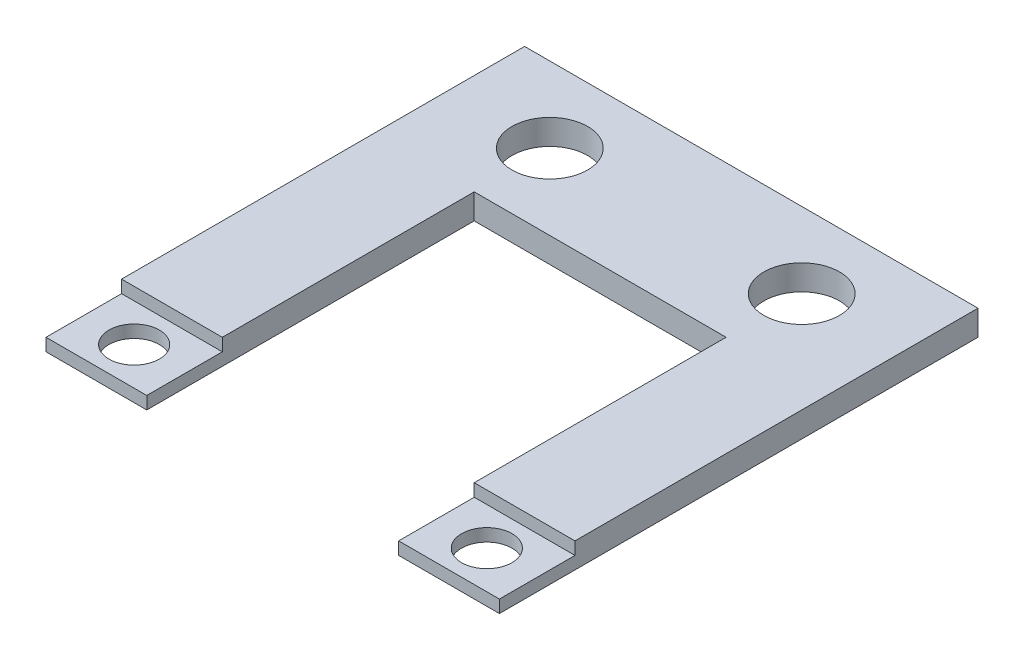
ISO-10303-21;
HEADER;
FILE_DESCRIPTION(('STEP AP214'),'2;1');
FILE_NAME('part.step','',(''),(''),'','','');
FILE_SCHEMA(('AUTOMOTIVE_DESIGN { 1 0 10303 214 1 1 1 1 }'));
ENDSEC;
DATA;
#1=APPLICATION_CONTEXT('core data for automotive mechanical design processes');
#2=APPLICATION_PROTOCOL_DEFINITION('international standard','automotive_design',2000,#1);
#3=PRODUCT_CONTEXT('',#1,'mechanical');
#4=PRODUCT('Part','Part','',(#3));
#5=PRODUCT_RELATED_PRODUCT_CATEGORY('part','',(#4));
#6=PRODUCT_DEFINITION_FORMATION('','',#4);
#7=PRODUCT_DEFINITION_CONTEXT('part definition',#1,'design');
#8=PRODUCT_DEFINITION('design','',#6,#7);
#9=PRODUCT_DEFINITION_SHAPE('','',#8);
#10=(LENGTH_UNIT() NAMED_UNIT(*) SI_UNIT(.MILLI.,.METRE.));
#11=(NAMED_UNIT(*) PLANE_ANGLE_UNIT() SI_UNIT($,.RADIAN.));
#12=(NAMED_UNIT(*) SI_UNIT($,.STERADIAN.) SOLID_ANGLE_UNIT());
#13=UNCERTAINTY_MEASURE_WITH_UNIT(LENGTH_MEASURE(1.E-05),#10,'distance_accuracy_value','');
#14=(GEOMETRIC_REPRESENTATION_CONTEXT(3) GLOBAL_UNCERTAINTY_ASSIGNED_CONTEXT((#13)) GLOBAL_UNIT_ASSIGNED_CONTEXT((#10,
#11,#12)) REPRESENTATION_CONTEXT('',''));
#15=CARTESIAN_POINT('',(0.,0.,0.));
#16=DIRECTION('',(0.,0.,1.));
#17=DIRECTION('',(1.,0.,0.));
#18=AXIS2_PLACEMENT_3D('',#15,#16,#17);
#19=CARTESIAN_POINT('',(7.9375,0.79375,0.));
#20=DIRECTION('',(-1.,0.,0.));
#21=DIRECTION('',(0.,0.,1.));
#22=AXIS2_PLACEMENT_3D('',#19,#20,#21);
#23=PLANE('',#22);
#24=DIRECTION('',(0.,1.,0.));
#25=VECTOR('',#24,1.);
#26=CARTESIAN_POINT('',(7.9375,0.,10.31875));
#27=LINE('',#26,#25);
#28=CARTESIAN_POINT('',(7.9375,0.,10.31875));
#29=VERTEX_POINT('',#28);
#30=CARTESIAN_POINT('',(7.9375,0.79375,10.31875));
#31=VERTEX_POINT('',#30);
#32=EDGE_CURVE('E178',#29,#31,#27,.T.);
#33=ORIENTED_EDGE('',*,*,#32,.T.);
#34=DIRECTION('',(0.,0.,-1.));
#35=VECTOR('',#34,1.);
#36=CARTESIAN_POINT('',(7.9375,0.79375,0.));
#37=LINE('',#36,#35);
#38=CARTESIAN_POINT('',(7.9375,0.79375,-5.55625));
#39=VERTEX_POINT('',#38);
#40=EDGE_CURVE('E196',#31,#39,#37,.T.);
#41=ORIENTED_EDGE('',*,*,#40,.T.);
#42=DIRECTION('',(0.,-1.,0.));
#43=VECTOR('',#42,1.);
#44=CARTESIAN_POINT('',(7.9375,0.79375,-5.55625));
#45=LINE('',#44,#43);
#46=CARTESIAN_POINT('',(7.9375,-0.79375,-5.55625));
#47=VERTEX_POINT('',#46);
#48=EDGE_CURVE('E213',#39,#47,#45,.T.);
#49=ORIENTED_EDGE('',*,*,#48,.T.);
#50=DIRECTION('',(0.,0.,-1.));
#51=VECTOR('',#50,1.);
#52=CARTESIAN_POINT('',(7.9375,-0.79375,0.));
#53=LINE('',#52,#51);
#54=CARTESIAN_POINT('',(7.9375,-0.79375,15.08125));
#55=VERTEX_POINT('',#54);
#56=EDGE_CURVE('E181',#55,#47,#53,.T.);
#57=ORIENTED_EDGE('',*,*,#56,.F.);
#58=DIRECTION('',(0.,-1.,0.));
#59=VECTOR('',#58,1.);
#60=CARTESIAN_POINT('',(7.9375,0.79375,15.08125));
#61=LINE('',#60,#59);
#62=CARTESIAN_POINT('',(7.9375,0.,15.08125));
#63=VERTEX_POINT('',#62);
#64=EDGE_CURVE('E11',#63,#55,#61,.T.);
#65=ORIENTED_EDGE('',*,*,#64,.F.);
#66=DIRECTION('',(0.,0.,1.));
#67=VECTOR('',#66,1.);
#68=CARTESIAN_POINT('',(7.9375,0.,15.08125));
#69=LINE('',#68,#67);
#70=EDGE_CURVE('E183',#29,#63,#69,.T.);
#71=ORIENTED_EDGE('',*,*,#70,.F.);
#72=EDGE_LOOP('',(#33,#41,#49,#57,#65,#71));
#73=FACE_BOUND('',#72,.T.);
#74=ADVANCED_FACE('F33',(#73),#23,.T.);
#75=CARTESIAN_POINT('',(0.,0.79375,15.08125));
#76=DIRECTION('',(0.,0.,-1.));
#77=DIRECTION('',(-1.,0.,0.));
#78=AXIS2_PLACEMENT_3D('',#75,#76,#77);
#79=PLANE('',#78);
#80=DIRECTION('',(0.,-1.,0.));
#81=VECTOR('',#80,1.);
#82=CARTESIAN_POINT('',(14.2875,0.79375,15.08125));
#83=LINE('',#82,#81);
#84=CARTESIAN_POINT('',(14.2875,0.,15.08125));
#85=VERTEX_POINT('',#84);
#86=CARTESIAN_POINT('',(14.2875,-0.79375,15.08125));
#87=VERTEX_POINT('',#86);
#88=EDGE_CURVE('E41',#85,#87,#83,.T.);
#89=ORIENTED_EDGE('',*,*,#88,.F.);
#90=DIRECTION('',(1.,0.,0.));
#91=VECTOR('',#90,1.);
#92=CARTESIAN_POINT('',(7.9375,0.,15.08125));
#93=LINE('',#92,#91);
#94=EDGE_CURVE('E185',#63,#85,#93,.T.);
#95=ORIENTED_EDGE('',*,*,#94,.F.);
#96=ORIENTED_EDGE('',*,*,#64,.T.);
#97=DIRECTION('',(1.,0.,0.));
#98=VECTOR('',#97,1.);
#99=CARTESIAN_POINT('',(0.,-0.79375,15.08125));
#100=LINE('',#99,#98);
#101=EDGE_CURVE('E216',#55,#87,#100,.T.);
#102=ORIENTED_EDGE('',*,*,#101,.T.);
#103=EDGE_LOOP('',(#89,#95,#96,#102));
#104=FACE_BOUND('',#103,.T.);
#105=ADVANCED_FACE('F266',(#104),#79,.F.);
#106=CARTESIAN_POINT('',(14.2875,0.79375,0.));
#107=DIRECTION('',(1.,0.,0.));
#108=DIRECTION('',(0.,0.,-1.));
#109=AXIS2_PLACEMENT_3D('',#106,#107,#108);
#110=PLANE('',#109);
#111=DIRECTION('',(0.,1.,0.));
#112=VECTOR('',#111,1.);
#113=CARTESIAN_POINT('',(14.2875,0.,10.31875));
#114=LINE('',#113,#112);
#115=CARTESIAN_POINT('',(14.2875,0.,10.31875));
#116=VERTEX_POINT('',#115);
#117=CARTESIAN_POINT('',(14.2875,0.79375,10.31875));
#118=VERTEX_POINT('',#117);
#119=EDGE_CURVE('E57',#116,#118,#114,.T.);
#120=ORIENTED_EDGE('',*,*,#119,.F.);
#121=DIRECTION('',(0.,0.,-1.));
#122=VECTOR('',#121,1.);
#123=CARTESIAN_POINT('',(14.2875,0.,15.08125));
#124=LINE('',#123,#122);
#125=EDGE_CURVE('E187',#85,#116,#124,.T.);
#126=ORIENTED_EDGE('',*,*,#125,.F.);
#127=ORIENTED_EDGE('',*,*,#88,.T.);
#128=DIRECTION('',(0.,0.,1.));
#129=VECTOR('',#128,1.);
#130=CARTESIAN_POINT('',(14.2875,-0.79375,0.));
#131=LINE('',#130,#129);
#132=CARTESIAN_POINT('',(14.2875,-0.79375,-15.08125));
#133=VERTEX_POINT('',#132);
#134=EDGE_CURVE('E219',#133,#87,#131,.T.);
#135=ORIENTED_EDGE('',*,*,#134,.F.);
#136=DIRECTION('',(0.,-1.,0.));
#137=VECTOR('',#136,1.);
#138=CARTESIAN_POINT('',(14.2875,0.79375,-15.08125));
#139=LINE('',#138,#137);
#140=CARTESIAN_POINT('',(14.2875,0.79375,-15.08125));
#141=VERTEX_POINT('',#140);
#142=EDGE_CURVE('E150',#141,#133,#139,.T.);
#143=ORIENTED_EDGE('',*,*,#142,.F.);
#144=DIRECTION('',(0.,0.,1.));
#145=VECTOR('',#144,1.);
#146=CARTESIAN_POINT('',(14.2875,0.79375,0.));
#147=LINE('',#146,#145);
#148=EDGE_CURVE('E198',#141,#118,#147,.T.);
#149=ORIENTED_EDGE('',*,*,#148,.T.);
#150=EDGE_LOOP('',(#120,#126,#127,#135,#143,#149));
#151=FACE_BOUND('',#150,.T.);
#152=ADVANCED_FACE('F261',(#151),#110,.T.);
#153=CARTESIAN_POINT('',(0.,0.79375,-15.08125));
#154=DIRECTION('',(0.,0.,-1.));
#155=DIRECTION('',(-1.,0.,0.));
#156=AXIS2_PLACEMENT_3D('',#153,#154,#155);
#157=PLANE('',#156);
#158=DIRECTION('',(1.,0.,0.));
#159=VECTOR('',#158,1.);
#160=CARTESIAN_POINT('',(0.,-0.79375,-15.08125));
#161=LINE('',#160,#159);
#162=CARTESIAN_POINT('',(-14.2875,-0.79375,-15.08125));
#163=VERTEX_POINT('',#162);
#164=EDGE_CURVE('E223',#163,#133,#161,.T.);
#165=ORIENTED_EDGE('',*,*,#164,.F.);
#166=DIRECTION('',(0.,-1.,0.));
#167=VECTOR('',#166,1.);
#168=CARTESIAN_POINT('',(-14.2875,0.79375,-15.08125));
#169=LINE('',#168,#167);
#170=CARTESIAN_POINT('',(-14.2875,0.79375,-15.08125));
#171=VERTEX_POINT('',#170);
#172=EDGE_CURVE('E148',#171,#163,#169,.T.);
#173=ORIENTED_EDGE('',*,*,#172,.F.);
#174=DIRECTION('',(1.,0.,0.));
#175=VECTOR('',#174,1.);
#176=CARTESIAN_POINT('',(0.,0.79375,-15.08125));
#177=LINE('',#176,#175);
#178=EDGE_CURVE('E202',#171,#141,#177,.T.);
#179=ORIENTED_EDGE('',*,*,#178,.T.);
#180=ORIENTED_EDGE('',*,*,#142,.T.);
#181=EDGE_LOOP('',(#165,#173,#179,#180));
#182=FACE_BOUND('',#181,.T.);
#183=ADVANCED_FACE('F258',(#182),#157,.T.);
#184=CARTESIAN_POINT('',(-14.2875,0.79375,0.));
#185=DIRECTION('',(1.,0.,0.));
#186=DIRECTION('',(0.,0.,-1.));
#187=AXIS2_PLACEMENT_3D('',#184,#185,#186);
#188=PLANE('',#187);
#189=DIRECTION('',(0.,0.,1.));
#190=VECTOR('',#189,1.);
#191=CARTESIAN_POINT('',(-14.2875,0.,15.08125));
#192=LINE('',#191,#190);
#193=CARTESIAN_POINT('',(-14.2875,0.,10.31875));
#194=VERTEX_POINT('',#193);
#195=CARTESIAN_POINT('',(-14.2875,0.,15.08125));
#196=VERTEX_POINT('',#195);
#197=EDGE_CURVE('E124',#194,#196,#192,.T.);
#198=ORIENTED_EDGE('',*,*,#197,.F.);
#199=DIRECTION('',(0.,1.,0.));
#200=VECTOR('',#199,1.);
#201=CARTESIAN_POINT('',(-14.2875,0.,10.31875));
#202=LINE('',#201,#200);
#203=CARTESIAN_POINT('',(-14.2875,0.79375,10.31875));
#204=VERTEX_POINT('',#203);
#205=EDGE_CURVE('E179',#194,#204,#202,.T.);
#206=ORIENTED_EDGE('',*,*,#205,.T.);
#207=DIRECTION('',(0.,0.,1.));
#208=VECTOR('',#207,1.);
#209=CARTESIAN_POINT('',(-14.2875,0.79375,0.));
#210=LINE('',#209,#208);
#211=EDGE_CURVE('E205',#171,#204,#210,.T.);
#212=ORIENTED_EDGE('',*,*,#211,.F.);
#213=ORIENTED_EDGE('',*,*,#172,.T.);
#214=DIRECTION('',(0.,0.,1.));
#215=VECTOR('',#214,1.);
#216=CARTESIAN_POINT('',(-14.2875,-0.79375,0.));
#217=LINE('',#216,#215);
#218=CARTESIAN_POINT('',(-14.2875,-0.79375,15.08125));
#219=VERTEX_POINT('',#218);
#220=EDGE_CURVE('E146',#163,#219,#217,.T.);
#221=ORIENTED_EDGE('',*,*,#220,.T.);
#222=DIRECTION('',(0.,-1.,0.));
#223=VECTOR('',#222,1.);
#224=CARTESIAN_POINT('',(-14.2875,0.79375,15.08125));
#225=LINE('',#224,#223);
#226=EDGE_CURVE('E139',#196,#219,#225,.T.);
#227=ORIENTED_EDGE('',*,*,#226,.F.);
#228=EDGE_LOOP('',(#198,#206,#212,#213,#221,#227));
#229=FACE_BOUND('',#228,.T.);
#230=ADVANCED_FACE('F144',(#229),#188,.F.);
#231=DIRECTION('',(0.,-1.,0.));
#232=VECTOR('',#231,1.);
#233=CARTESIAN_POINT('',(-7.9375,0.79375,15.08125));
#234=LINE('',#233,#232);
#235=CARTESIAN_POINT('',(-7.9375,0.,15.08125));
#236=VERTEX_POINT('',#235);
#237=CARTESIAN_POINT('',(-7.9375,-0.79375,15.08125));
#238=VERTEX_POINT('',#237);
#239=EDGE_CURVE('E141',#236,#238,#234,.T.);
#240=ORIENTED_EDGE('',*,*,#239,.F.);
#241=DIRECTION('',(1.,0.,0.));
#242=VECTOR('',#241,1.);
#243=CARTESIAN_POINT('',(-14.2875,0.,15.08125));
#244=LINE('',#243,#242);
#245=EDGE_CURVE('E127',#196,#236,#244,.T.);
#246=ORIENTED_EDGE('',*,*,#245,.F.);
#247=ORIENTED_EDGE('',*,*,#226,.T.);
#248=EDGE_CURVE('E220',#219,#238,#100,.T.);
#249=ORIENTED_EDGE('',*,*,#248,.T.);
#250=EDGE_LOOP('',(#240,#246,#247,#249));
#251=FACE_BOUND('',#250,.T.);
#252=ADVANCED_FACE('F137',(#251),#79,.F.);
#253=CARTESIAN_POINT('',(-7.9375,0.79375,0.));
#254=DIRECTION('',(-1.,0.,0.));
#255=DIRECTION('',(0.,0.,1.));
#256=AXIS2_PLACEMENT_3D('',#253,#254,#255);
#257=PLANE('',#256);
#258=DIRECTION('',(0.,0.,-1.));
#259=VECTOR('',#258,1.);
#260=CARTESIAN_POINT('',(-7.9375,0.79375,0.));
#261=LINE('',#260,#259);
#262=CARTESIAN_POINT('',(-7.9375,0.79375,10.31875));
#263=VERTEX_POINT('',#262);
#264=CARTESIAN_POINT('',(-7.9375,0.79375,-5.55625));
#265=VERTEX_POINT('',#264);
#266=EDGE_CURVE('E208',#263,#265,#261,.T.);
#267=ORIENTED_EDGE('',*,*,#266,.F.);
#268=DIRECTION('',(0.,1.,0.));
#269=VECTOR('',#268,1.);
#270=CARTESIAN_POINT('',(-7.9375,0.,10.31875));
#271=LINE('',#270,#269);
#272=CARTESIAN_POINT('',(-7.9375,0.,10.31875));
#273=VERTEX_POINT('',#272);
#274=EDGE_CURVE('E49',#273,#263,#271,.T.);
#275=ORIENTED_EDGE('',*,*,#274,.F.);
#276=DIRECTION('',(0.,0.,-1.));
#277=VECTOR('',#276,1.);
#278=CARTESIAN_POINT('',(-7.9375,0.,15.08125));
#279=LINE('',#278,#277);
#280=EDGE_CURVE('E142',#236,#273,#279,.T.);
#281=ORIENTED_EDGE('',*,*,#280,.F.);
#282=ORIENTED_EDGE('',*,*,#239,.T.);
#283=DIRECTION('',(0.,0.,-1.));
#284=VECTOR('',#283,1.);
#285=CARTESIAN_POINT('',(-7.9375,-0.79375,0.));
#286=LINE('',#285,#284);
#287=CARTESIAN_POINT('',(-7.9375,-0.79375,-5.55625));
#288=VERTEX_POINT('',#287);
#289=EDGE_CURVE('E227',#238,#288,#286,.T.);
#290=ORIENTED_EDGE('',*,*,#289,.T.);
#291=DIRECTION('',(0.,-1.,0.));
#292=VECTOR('',#291,1.);
#293=CARTESIAN_POINT('',(-7.9375,0.79375,-5.55625));
#294=LINE('',#293,#292);
#295=EDGE_CURVE('E152',#265,#288,#294,.T.);
#296=ORIENTED_EDGE('',*,*,#295,.F.);
#297=EDGE_LOOP('',(#267,#275,#281,#282,#290,#296));
#298=FACE_BOUND('',#297,.T.);
#299=ADVANCED_FACE('F251',(#298),#257,.F.);
#300=CARTESIAN_POINT('',(0.,0.79375,-5.55625));
#301=DIRECTION('',(0.,0.,-1.));
#302=DIRECTION('',(-1.,0.,0.));
#303=AXIS2_PLACEMENT_3D('',#300,#301,#302);
#304=PLANE('',#303);
#305=DIRECTION('',(1.,0.,0.));
#306=VECTOR('',#305,1.);
#307=CARTESIAN_POINT('',(0.,-0.79375,-5.55625));
#308=LINE('',#307,#306);
#309=EDGE_CURVE('E199',#288,#47,#308,.T.);
#310=ORIENTED_EDGE('',*,*,#309,.T.);
#311=ORIENTED_EDGE('',*,*,#48,.F.);
#312=DIRECTION('',(1.,0.,0.));
#313=VECTOR('',#312,1.);
#314=CARTESIAN_POINT('',(0.,0.79375,-5.55625));
#315=LINE('',#314,#313);
#316=EDGE_CURVE('E210',#265,#39,#315,.T.);
#317=ORIENTED_EDGE('',*,*,#316,.F.);
#318=ORIENTED_EDGE('',*,*,#295,.T.);
#319=EDGE_LOOP('',(#310,#311,#317,#318));
#320=FACE_BOUND('',#319,.T.);
#321=ADVANCED_FACE('F236',(#320),#304,.F.);
#322=CARTESIAN_POINT('',(0.,0.79375,0.));
#323=DIRECTION('',(0.,1.,0.));
#324=DIRECTION('',(0.,0.,1.));
#325=AXIS2_PLACEMENT_3D('',#322,#323,#324);
#326=PLANE('',#325);
#327=CARTESIAN_POINT('',(-7.9375,0.79375,-10.31875));
#328=DIRECTION('',(0.,1.,0.));
#329=DIRECTION('',(0.,0.,1.));
#330=AXIS2_PLACEMENT_3D('',#327,#328,#329);
#331=CIRCLE('',#330,2.38125);
#332=CARTESIAN_POINT('',(-7.9375,0.79375,-7.9375));
#333=VERTEX_POINT('',#332);
#334=EDGE_CURVE('E170',#333,#333,#331,.T.);
#335=ORIENTED_EDGE('',*,*,#334,.F.);
#336=EDGE_LOOP('',(#335));
#337=FACE_BOUND('',#336,.T.);
#338=CARTESIAN_POINT('',(7.93749999999993,0.79375,-10.31875));
#339=DIRECTION('',(0.,1.,0.));
#340=DIRECTION('',(0.,0.,1.));
#341=AXIS2_PLACEMENT_3D('',#338,#339,#340);
#342=CIRCLE('',#341,2.38125000000001);
#343=CARTESIAN_POINT('',(7.93749999999993,0.79375,-7.93749999999999));
#344=VERTEX_POINT('',#343);
#345=EDGE_CURVE('E418',#344,#344,#342,.T.);
#346=ORIENTED_EDGE('',*,*,#345,.F.);
#347=EDGE_LOOP('',(#346));
#348=FACE_BOUND('',#347,.T.);
#349=DIRECTION('',(-1.,0.,0.));
#350=VECTOR('',#349,1.);
#351=CARTESIAN_POINT('',(-14.2875,0.79375,10.31875));
#352=LINE('',#351,#350);
#353=EDGE_CURVE('E133',#263,#204,#352,.T.);
#354=ORIENTED_EDGE('',*,*,#353,.F.);
#355=ORIENTED_EDGE('',*,*,#266,.T.);
#356=ORIENTED_EDGE('',*,*,#316,.T.);
#357=ORIENTED_EDGE('',*,*,#40,.F.);
#358=DIRECTION('',(-1.,0.,0.));
#359=VECTOR('',#358,1.);
#360=CARTESIAN_POINT('',(7.9375,0.79375,10.31875));
#361=LINE('',#360,#359);
#362=EDGE_CURVE('E163',#118,#31,#361,.T.);
#363=ORIENTED_EDGE('',*,*,#362,.F.);
#364=ORIENTED_EDGE('',*,*,#148,.F.);
#365=ORIENTED_EDGE('',*,*,#178,.F.);
#366=ORIENTED_EDGE('',*,*,#211,.T.);
#367=EDGE_LOOP('',(#354,#355,#356,#357,#363,#364,#365,#366));
#368=FACE_BOUND('',#367,.T.);
#369=ADVANCED_FACE('F250',(#337,#348,#368),#326,.T.);
#370=CARTESIAN_POINT('',(0.,-0.79375,0.));
#371=DIRECTION('',(0.,1.,0.));
#372=DIRECTION('',(0.,0.,1.));
#373=AXIS2_PLACEMENT_3D('',#370,#371,#372);
#374=PLANE('',#373);
#375=CARTESIAN_POINT('',(-7.9375,-0.79375,-10.31875));
#376=DIRECTION('',(0.,1.,0.));
#377=DIRECTION('',(0.,0.,1.));
#378=AXIS2_PLACEMENT_3D('',#375,#376,#377);
#379=CIRCLE('',#378,2.38125);
#380=CARTESIAN_POINT('',(-7.9375,-0.79375,-7.9375));
#381=VERTEX_POINT('',#380);
#382=EDGE_CURVE('E165',#381,#381,#379,.F.);
#383=ORIENTED_EDGE('',*,*,#382,.F.);
#384=EDGE_LOOP('',(#383));
#385=FACE_BOUND('',#384,.T.);
#386=CARTESIAN_POINT('',(11.1125000000001,-0.79375,12.7));
#387=DIRECTION('',(0.,1.,0.));
#388=DIRECTION('',(0.,0.,1.));
#389=AXIS2_PLACEMENT_3D('',#386,#387,#388);
#390=CIRCLE('',#389,1.5875);
#391=CARTESIAN_POINT('',(11.1125000000001,-0.79375,14.2875));
#392=VERTEX_POINT('',#391);
#393=EDGE_CURVE('E173',#392,#392,#390,.F.);
#394=ORIENTED_EDGE('',*,*,#393,.F.);
#395=EDGE_LOOP('',(#394));
#396=FACE_BOUND('',#395,.T.);
#397=CARTESIAN_POINT('',(7.93749999999993,-0.79375,-10.31875));
#398=DIRECTION('',(0.,1.,0.));
#399=DIRECTION('',(0.,0.,1.));
#400=AXIS2_PLACEMENT_3D('',#397,#398,#399);
#401=CIRCLE('',#400,2.38125000000001);
#402=CARTESIAN_POINT('',(7.93749999999993,-0.79375,-7.93749999999999));
#403=VERTEX_POINT('',#402);
#404=EDGE_CURVE('E414',#403,#403,#401,.F.);
#405=ORIENTED_EDGE('',*,*,#404,.F.);
#406=EDGE_LOOP('',(#405));
#407=FACE_BOUND('',#406,.T.);
#408=CARTESIAN_POINT('',(-11.1125,-0.79375,12.7));
#409=DIRECTION('',(0.,1.,0.));
#410=DIRECTION('',(0.,0.,1.));
#411=AXIS2_PLACEMENT_3D('',#408,#409,#410);
#412=CIRCLE('',#411,1.5875);
#413=CARTESIAN_POINT('',(-11.1125,-0.79375,14.2875));
#414=VERTEX_POINT('',#413);
#415=EDGE_CURVE('E159',#414,#414,#412,.F.);
#416=ORIENTED_EDGE('',*,*,#415,.F.);
#417=EDGE_LOOP('',(#416));
#418=FACE_BOUND('',#417,.T.);
#419=ORIENTED_EDGE('',*,*,#56,.T.);
#420=ORIENTED_EDGE('',*,*,#309,.F.);
#421=ORIENTED_EDGE('',*,*,#289,.F.);
#422=ORIENTED_EDGE('',*,*,#248,.F.);
#423=ORIENTED_EDGE('',*,*,#220,.F.);
#424=ORIENTED_EDGE('',*,*,#164,.T.);
#425=ORIENTED_EDGE('',*,*,#134,.T.);
#426=ORIENTED_EDGE('',*,*,#101,.F.);
#427=EDGE_LOOP('',(#419,#420,#421,#422,#423,#424,#425,#426));
#428=FACE_BOUND('',#427,.T.);
#429=ADVANCED_FACE('F242',(#385,#396,#407,#418,#428),#374,.F.);
#430=CARTESIAN_POINT('',(7.9375,0.,10.31875));
#431=DIRECTION('',(0.,0.,-1.));
#432=DIRECTION('',(-1.,0.,0.));
#433=AXIS2_PLACEMENT_3D('',#430,#431,#432);
#434=PLANE('',#433);
#435=ORIENTED_EDGE('',*,*,#362,.T.);
#436=ORIENTED_EDGE('',*,*,#32,.F.);
#437=DIRECTION('',(-1.,0.,0.));
#438=VECTOR('',#437,1.);
#439=CARTESIAN_POINT('',(7.9375,0.,10.31875));
#440=LINE('',#439,#438);
#441=EDGE_CURVE('E189',#116,#29,#440,.T.);
#442=ORIENTED_EDGE('',*,*,#441,.F.);
#443=ORIENTED_EDGE('',*,*,#119,.T.);
#444=EDGE_LOOP('',(#435,#436,#442,#443));
#445=FACE_BOUND('',#444,.T.);
#446=ADVANCED_FACE('F269',(#445),#434,.F.);
#447=CARTESIAN_POINT('',(0.,0.,0.));
#448=DIRECTION('',(0.,-1.,0.));
#449=DIRECTION('',(0.,0.,-1.));
#450=AXIS2_PLACEMENT_3D('',#447,#448,#449);
#451=PLANE('',#450);
#452=CARTESIAN_POINT('',(11.1125000000001,0.,12.7));
#453=DIRECTION('',(0.,-1.,0.));
#454=DIRECTION('',(0.,0.,-1.));
#455=AXIS2_PLACEMENT_3D('',#452,#453,#454);
#456=CIRCLE('',#455,1.5875);
#457=CARTESIAN_POINT('',(11.1125000000001,0.,11.1125));
#458=VERTEX_POINT('',#457);
#459=EDGE_CURVE('E36',#458,#458,#456,.T.);
#460=ORIENTED_EDGE('',*,*,#459,.T.);
#461=EDGE_LOOP('',(#460));
#462=FACE_BOUND('',#461,.T.);
#463=ORIENTED_EDGE('',*,*,#70,.T.);
#464=ORIENTED_EDGE('',*,*,#94,.T.);
#465=ORIENTED_EDGE('',*,*,#125,.T.);
#466=ORIENTED_EDGE('',*,*,#441,.T.);
#467=EDGE_LOOP('',(#463,#464,#465,#466));
#468=FACE_BOUND('',#467,.T.);
#469=ADVANCED_FACE('F268',(#462,#468),#451,.F.);
#470=CARTESIAN_POINT('',(-14.2875,0.,10.31875));
#471=DIRECTION('',(0.,0.,-1.));
#472=DIRECTION('',(-1.,0.,0.));
#473=AXIS2_PLACEMENT_3D('',#470,#471,#472);
#474=PLANE('',#473);
#475=ORIENTED_EDGE('',*,*,#353,.T.);
#476=ORIENTED_EDGE('',*,*,#205,.F.);
#477=DIRECTION('',(-1.,0.,0.));
#478=VECTOR('',#477,1.);
#479=CARTESIAN_POINT('',(-14.2875,0.,10.31875));
#480=LINE('',#479,#478);
#481=EDGE_CURVE('E129',#273,#194,#480,.T.);
#482=ORIENTED_EDGE('',*,*,#481,.F.);
#483=ORIENTED_EDGE('',*,*,#274,.T.);
#484=EDGE_LOOP('',(#475,#476,#482,#483));
#485=FACE_BOUND('',#484,.T.);
#486=ADVANCED_FACE('F252',(#485),#474,.F.);
#487=CARTESIAN_POINT('',(0.,0.,0.));
#488=DIRECTION('',(0.,-1.,0.));
#489=DIRECTION('',(0.,0.,-1.));
#490=AXIS2_PLACEMENT_3D('',#487,#488,#489);
#491=PLANE('',#490);
#492=CARTESIAN_POINT('',(-11.1125,0.,12.7));
#493=DIRECTION('',(0.,-1.,0.));
#494=DIRECTION('',(0.,0.,-1.));
#495=AXIS2_PLACEMENT_3D('',#492,#493,#494);
#496=CIRCLE('',#495,1.5875);
#497=CARTESIAN_POINT('',(-11.1125,0.,11.1125));
#498=VERTEX_POINT('',#497);
#499=EDGE_CURVE('E157',#498,#498,#496,.T.);
#500=ORIENTED_EDGE('',*,*,#499,.T.);
#501=EDGE_LOOP('',(#500));
#502=FACE_BOUND('',#501,.T.);
#503=ORIENTED_EDGE('',*,*,#197,.T.);
#504=ORIENTED_EDGE('',*,*,#245,.T.);
#505=ORIENTED_EDGE('',*,*,#280,.T.);
#506=ORIENTED_EDGE('',*,*,#481,.T.);
#507=EDGE_LOOP('',(#503,#504,#505,#506));
#508=FACE_BOUND('',#507,.T.);
#509=ADVANCED_FACE('F126',(#502,#508),#491,.F.);
#510=CARTESIAN_POINT('',(-11.1125,-7.52894209080189,12.7));
#511=DIRECTION('',(0.,1.,0.));
#512=DIRECTION('',(0.,0.,1.));
#513=AXIS2_PLACEMENT_3D('',#510,#511,#512);
#514=CYLINDRICAL_SURFACE('',#513,1.5875);
#515=ORIENTED_EDGE('',*,*,#415,.T.);
#516=EDGE_LOOP('',(#515));
#517=FACE_BOUND('',#516,.T.);
#518=ORIENTED_EDGE('',*,*,#499,.F.);
#519=EDGE_LOOP('',(#518));
#520=FACE_BOUND('',#519,.T.);
#521=ADVANCED_FACE('F366',(#517,#520),#514,.F.);
#522=CARTESIAN_POINT('',(11.1125000000001,-7.52894209080189,12.7));
#523=DIRECTION('',(0.,1.,0.));
#524=DIRECTION('',(0.,0.,1.));
#525=AXIS2_PLACEMENT_3D('',#522,#523,#524);
#526=CYLINDRICAL_SURFACE('',#525,1.5875);
#527=ORIENTED_EDGE('',*,*,#393,.T.);
#528=EDGE_LOOP('',(#527));
#529=FACE_BOUND('',#528,.T.);
#530=ORIENTED_EDGE('',*,*,#459,.F.);
#531=EDGE_LOOP('',(#530));
#532=FACE_BOUND('',#531,.T.);
#533=ADVANCED_FACE('F375',(#529,#532),#526,.F.);
#534=CARTESIAN_POINT('',(7.93749999999993,-7.52894209080189,-10.31875));
#535=DIRECTION('',(0.,1.,0.));
#536=DIRECTION('',(0.,0.,1.));
#537=AXIS2_PLACEMENT_3D('',#534,#535,#536);
#538=CYLINDRICAL_SURFACE('',#537,2.38125000000001);
#539=ORIENTED_EDGE('',*,*,#404,.T.);
#540=EDGE_LOOP('',(#539));
#541=FACE_BOUND('',#540,.T.);
#542=ORIENTED_EDGE('',*,*,#345,.T.);
#543=EDGE_LOOP('',(#542));
#544=FACE_BOUND('',#543,.T.);
#545=ADVANCED_FACE('F384',(#541,#544),#538,.F.);
#546=CARTESIAN_POINT('',(-7.9375,-7.52894209080189,-10.31875));
#547=DIRECTION('',(0.,1.,0.));
#548=DIRECTION('',(0.,0.,1.));
#549=AXIS2_PLACEMENT_3D('',#546,#547,#548);
#550=CYLINDRICAL_SURFACE('',#549,2.38125);
#551=ORIENTED_EDGE('',*,*,#382,.T.);
#552=EDGE_LOOP('',(#551));
#553=FACE_BOUND('',#552,.T.);
#554=ORIENTED_EDGE('',*,*,#334,.T.);
#555=EDGE_LOOP('',(#554));
#556=FACE_BOUND('',#555,.T.);
#557=ADVANCED_FACE('F394',(#553,#556),#550,.F.);
#558=CLOSED_SHELL('',(#74,#105,#152,#183,#230,#252,#299,#321,#369,#429,#446,#469,#486,#509,#521,
#533,#545,#557));
#559=MANIFOLD_SOLID_BREP('B2',#558);
#560=ADVANCED_BREP_SHAPE_REPRESENTATION('',(#18,#559),#14);
#561=SHAPE_DEFINITION_REPRESENTATION(#9,#560);
ENDSEC;
END-ISO-10303-21;
